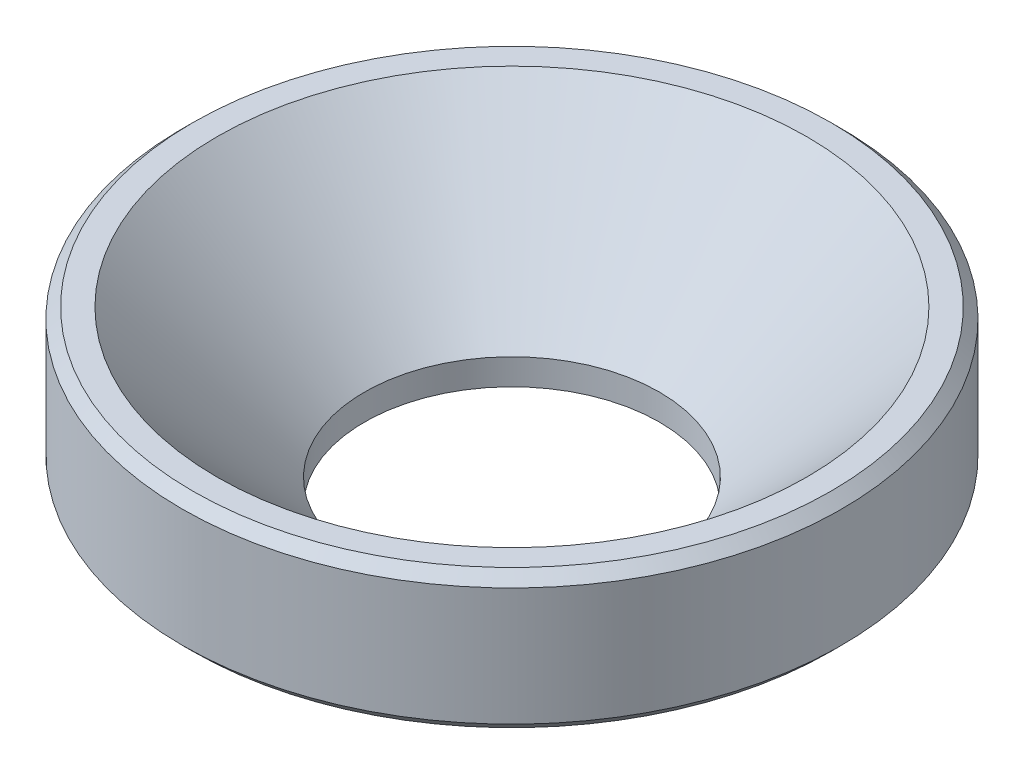
ISO-10303-21;
HEADER;
FILE_DESCRIPTION(('STEP AP214'),'2;1');
FILE_NAME('part.step','',(''),(''),'','','');
FILE_SCHEMA(('AUTOMOTIVE_DESIGN { 1 0 10303 214 1 1 1 1 }'));
ENDSEC;
DATA;
#1=APPLICATION_CONTEXT('core data for automotive mechanical design processes');
#2=APPLICATION_PROTOCOL_DEFINITION('international standard','automotive_design',2000,#1);
#3=PRODUCT_CONTEXT('',#1,'mechanical');
#4=PRODUCT('Part','Part','',(#3));
#5=PRODUCT_RELATED_PRODUCT_CATEGORY('part','',(#4));
#6=PRODUCT_DEFINITION_FORMATION('','',#4);
#7=PRODUCT_DEFINITION_CONTEXT('part definition',#1,'design');
#8=PRODUCT_DEFINITION('design','',#6,#7);
#9=PRODUCT_DEFINITION_SHAPE('','',#8);
#10=(LENGTH_UNIT() NAMED_UNIT(*) SI_UNIT(.MILLI.,.METRE.));
#11=(NAMED_UNIT(*) PLANE_ANGLE_UNIT() SI_UNIT($,.RADIAN.));
#12=(NAMED_UNIT(*) SI_UNIT($,.STERADIAN.) SOLID_ANGLE_UNIT());
#13=UNCERTAINTY_MEASURE_WITH_UNIT(LENGTH_MEASURE(1.E-05),#10,'distance_accuracy_value','');
#14=(GEOMETRIC_REPRESENTATION_CONTEXT(3) GLOBAL_UNCERTAINTY_ASSIGNED_CONTEXT((#13)) GLOBAL_UNIT_ASSIGNED_CONTEXT((#10,
#11,#12)) REPRESENTATION_CONTEXT('',''));
#15=CARTESIAN_POINT('',(0.,0.,0.));
#16=DIRECTION('',(0.,0.,1.));
#17=DIRECTION('',(1.,0.,0.));
#18=AXIS2_PLACEMENT_3D('',#15,#16,#17);
#19=CARTESIAN_POINT('',(0.,1.3,0.));
#20=DIRECTION('',(0.,1.,0.));
#21=DIRECTION('',(0.,0.,1.));
#22=AXIS2_PLACEMENT_3D('',#19,#20,#21);
#23=CONICAL_SURFACE('',#22,9.5,0.785398163397451);
#24=CARTESIAN_POINT('',(0.,1.,0.));
#25=DIRECTION('',(0.,-1.,0.));
#26=DIRECTION('',(0.,0.,1.));
#27=AXIS2_PLACEMENT_3D('',#24,#25,#26);
#28=CIRCLE('',#27,9.2);
#29=CARTESIAN_POINT('',(0.,1.,9.2));
#30=VERTEX_POINT('',#29);
#31=EDGE_CURVE('E68',#30,#30,#28,.T.);
#32=ORIENTED_EDGE('',*,*,#31,.F.);
#33=EDGE_LOOP('',(#32));
#34=FACE_BOUND('',#33,.T.);
#35=CARTESIAN_POINT('',(0.,1.3,0.));
#36=DIRECTION('',(0.,1.,0.));
#37=DIRECTION('',(0.,0.,1.));
#38=AXIS2_PLACEMENT_3D('',#35,#36,#37);
#39=CIRCLE('',#38,9.5);
#40=CARTESIAN_POINT('',(0.,1.3,9.5));
#41=VERTEX_POINT('',#40);
#42=EDGE_CURVE('E64',#41,#41,#39,.T.);
#43=ORIENTED_EDGE('',*,*,#42,.F.);
#44=EDGE_LOOP('',(#43));
#45=FACE_BOUND('',#44,.T.);
#46=ADVANCED_FACE('F17',(#34,#45),#23,.T.);
#47=CARTESIAN_POINT('',(0.,5.,0.));
#48=DIRECTION('',(0.,-1.,0.));
#49=DIRECTION('',(0.,0.,-1.));
#50=AXIS2_PLACEMENT_3D('',#47,#48,#49);
#51=CONICAL_SURFACE('',#50,9.2,0.785398163397448);
#52=CARTESIAN_POINT('',(0.,5.,0.));
#53=DIRECTION('',(0.,1.,0.));
#54=DIRECTION('',(0.,0.,1.));
#55=AXIS2_PLACEMENT_3D('',#52,#53,#54);
#56=CIRCLE('',#55,9.2);
#57=CARTESIAN_POINT('',(0.,5.,9.2));
#58=VERTEX_POINT('',#57);
#59=EDGE_CURVE('E80',#58,#58,#56,.T.);
#60=ORIENTED_EDGE('',*,*,#59,.F.);
#61=EDGE_LOOP('',(#60));
#62=FACE_BOUND('',#61,.T.);
#63=CARTESIAN_POINT('',(0.,4.7,0.));
#64=DIRECTION('',(0.,-1.,0.));
#65=DIRECTION('',(0.,0.,1.));
#66=AXIS2_PLACEMENT_3D('',#63,#64,#65);
#67=CIRCLE('',#66,9.5);
#68=CARTESIAN_POINT('',(0.,4.7,9.5));
#69=VERTEX_POINT('',#68);
#70=EDGE_CURVE('E26',#69,#69,#67,.T.);
#71=ORIENTED_EDGE('',*,*,#70,.F.);
#72=EDGE_LOOP('',(#71));
#73=FACE_BOUND('',#72,.T.);
#74=ADVANCED_FACE('F112',(#62,#73),#51,.T.);
#75=CARTESIAN_POINT('',(0.,5.,0.));
#76=DIRECTION('',(0.,1.,0.));
#77=DIRECTION('',(0.,0.,1.));
#78=AXIS2_PLACEMENT_3D('',#75,#76,#77);
#79=CONICAL_SURFACE('',#78,8.5,0.78539816339745);
#80=CARTESIAN_POINT('',(0.,0.750000000000014,0.));
#81=DIRECTION('',(0.,1.,0.));
#82=DIRECTION('',(0.,0.,1.));
#83=AXIS2_PLACEMENT_3D('',#80,#81,#82);
#84=CIRCLE('',#83,4.25);
#85=CARTESIAN_POINT('',(0.,0.750000000000014,4.25));
#86=VERTEX_POINT('',#85);
#87=EDGE_CURVE('E11',#86,#86,#84,.T.);
#88=ORIENTED_EDGE('',*,*,#87,.F.);
#89=EDGE_LOOP('',(#88));
#90=FACE_BOUND('',#89,.T.);
#91=CARTESIAN_POINT('',(0.,5.,0.));
#92=DIRECTION('',(0.,1.,0.));
#93=DIRECTION('',(0.,0.,1.));
#94=AXIS2_PLACEMENT_3D('',#91,#92,#93);
#95=CIRCLE('',#94,8.5);
#96=CARTESIAN_POINT('',(0.,5.,8.5));
#97=VERTEX_POINT('',#96);
#98=EDGE_CURVE('E76',#97,#97,#95,.T.);
#99=ORIENTED_EDGE('',*,*,#98,.T.);
#100=EDGE_LOOP('',(#99));
#101=FACE_BOUND('',#100,.T.);
#102=ADVANCED_FACE('F118',(#90,#101),#79,.F.);
#103=CARTESIAN_POINT('',(0.,5.,0.));
#104=DIRECTION('',(0.,1.,0.));
#105=DIRECTION('',(0.,0.,1.));
#106=AXIS2_PLACEMENT_3D('',#103,#104,#105);
#107=CYLINDRICAL_SURFACE('',#106,4.25);
#108=CARTESIAN_POINT('',(0.,0.,0.));
#109=DIRECTION('',(0.,1.,0.));
#110=DIRECTION('',(0.,0.,1.));
#111=AXIS2_PLACEMENT_3D('',#108,#109,#110);
#112=CIRCLE('',#111,4.25);
#113=CARTESIAN_POINT('',(0.,0.,4.25));
#114=VERTEX_POINT('',#113);
#115=EDGE_CURVE('E84',#114,#114,#112,.T.);
#116=ORIENTED_EDGE('',*,*,#115,.F.);
#117=EDGE_LOOP('',(#116));
#118=FACE_BOUND('',#117,.T.);
#119=ORIENTED_EDGE('',*,*,#87,.T.);
#120=EDGE_LOOP('',(#119));
#121=FACE_BOUND('',#120,.T.);
#122=ADVANCED_FACE('F134',(#118,#121),#107,.F.);
#123=CARTESIAN_POINT('',(0.,5.,0.));
#124=DIRECTION('',(0.,-1.,0.));
#125=DIRECTION('',(0.,0.,-1.));
#126=AXIS2_PLACEMENT_3D('',#123,#124,#125);
#127=CYLINDRICAL_SURFACE('',#126,9.5);
#128=ORIENTED_EDGE('',*,*,#70,.T.);
#129=EDGE_LOOP('',(#128));
#130=FACE_BOUND('',#129,.T.);
#131=ORIENTED_EDGE('',*,*,#42,.T.);
#132=EDGE_LOOP('',(#131));
#133=FACE_BOUND('',#132,.T.);
#134=ADVANCED_FACE('F65',(#130,#133),#127,.T.);
#135=CARTESIAN_POINT('',(0.,1.,0.));
#136=DIRECTION('',(0.,1.,0.));
#137=DIRECTION('',(1.,0.,0.));
#138=AXIS2_PLACEMENT_3D('',#135,#136,#137);
#139=PLANE('',#138);
#140=CARTESIAN_POINT('',(0.,1.,0.));
#141=DIRECTION('',(0.,1.,0.));
#142=DIRECTION('',(0.,0.,1.));
#143=AXIS2_PLACEMENT_3D('',#140,#141,#142);
#144=CIRCLE('',#143,6.);
#145=CARTESIAN_POINT('',(0.,1.,6.));
#146=VERTEX_POINT('',#145);
#147=EDGE_CURVE('E83',#146,#146,#144,.T.);
#148=ORIENTED_EDGE('',*,*,#147,.T.);
#149=EDGE_LOOP('',(#148));
#150=FACE_BOUND('',#149,.T.);
#151=ORIENTED_EDGE('',*,*,#31,.T.);
#152=EDGE_LOOP('',(#151));
#153=FACE_BOUND('',#152,.T.);
#154=ADVANCED_FACE('F123',(#150,#153),#139,.F.);
#155=CARTESIAN_POINT('',(0.,5.,0.));
#156=DIRECTION('',(0.,1.,0.));
#157=DIRECTION('',(1.,0.,0.));
#158=AXIS2_PLACEMENT_3D('',#155,#156,#157);
#159=PLANE('',#158);
#160=ORIENTED_EDGE('',*,*,#98,.F.);
#161=EDGE_LOOP('',(#160));
#162=FACE_BOUND('',#161,.T.);
#163=ORIENTED_EDGE('',*,*,#59,.T.);
#164=EDGE_LOOP('',(#163));
#165=FACE_BOUND('',#164,.T.);
#166=ADVANCED_FACE('F108',(#162,#165),#159,.T.);
#167=CARTESIAN_POINT('',(0.,1.,0.));
#168=DIRECTION('',(0.,-1.,0.));
#169=DIRECTION('',(0.,0.,-1.));
#170=AXIS2_PLACEMENT_3D('',#167,#168,#169);
#171=CYLINDRICAL_SURFACE('',#170,6.);
#172=ORIENTED_EDGE('',*,*,#147,.F.);
#173=EDGE_LOOP('',(#172));
#174=FACE_BOUND('',#173,.T.);
#175=CARTESIAN_POINT('',(0.,0.,0.));
#176=DIRECTION('',(0.,1.,0.));
#177=DIRECTION('',(0.,0.,1.));
#178=AXIS2_PLACEMENT_3D('',#175,#176,#177);
#179=CIRCLE('',#178,6.);
#180=CARTESIAN_POINT('',(0.,0.,6.));
#181=VERTEX_POINT('',#180);
#182=EDGE_CURVE('E87',#181,#181,#179,.T.);
#183=ORIENTED_EDGE('',*,*,#182,.T.);
#184=EDGE_LOOP('',(#183));
#185=FACE_BOUND('',#184,.T.);
#186=ADVANCED_FACE('F97',(#174,#185),#171,.T.);
#187=CARTESIAN_POINT('',(0.,0.,0.));
#188=DIRECTION('',(0.,1.,0.));
#189=DIRECTION('',(1.,0.,0.));
#190=AXIS2_PLACEMENT_3D('',#187,#188,#189);
#191=PLANE('',#190);
#192=ORIENTED_EDGE('',*,*,#115,.T.);
#193=EDGE_LOOP('',(#192));
#194=FACE_BOUND('',#193,.T.);
#195=ORIENTED_EDGE('',*,*,#182,.F.);
#196=EDGE_LOOP('',(#195));
#197=FACE_BOUND('',#196,.T.);
#198=ADVANCED_FACE('F99',(#194,#197),#191,.F.);
#199=CLOSED_SHELL('',(#46,#74,#102,#122,#134,#154,#166,#186,#198));
#200=MANIFOLD_SOLID_BREP('B1',#199);
#201=ADVANCED_BREP_SHAPE_REPRESENTATION('',(#18,#200),#14);
#202=SHAPE_DEFINITION_REPRESENTATION(#9,#201);
ENDSEC;
END-ISO-10303-21;
